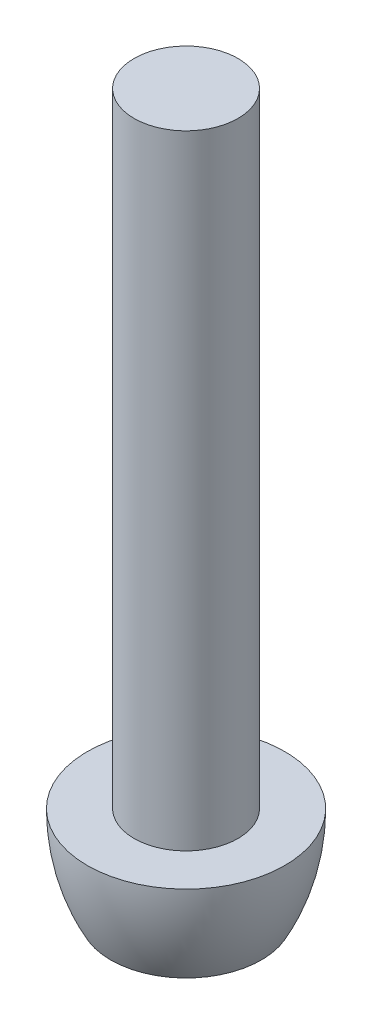
ISO-10303-21;
HEADER;
FILE_DESCRIPTION(('STEP AP214'),'2;1');
FILE_NAME('part.step','',(''),(''),'','','');
FILE_SCHEMA(('AUTOMOTIVE_DESIGN { 1 0 10303 214 1 1 1 1 }'));
ENDSEC;
DATA;
#1=APPLICATION_CONTEXT('core data for automotive mechanical design processes');
#2=APPLICATION_PROTOCOL_DEFINITION('international standard','automotive_design',2000,#1);
#3=PRODUCT_CONTEXT('',#1,'mechanical');
#4=PRODUCT('Part','Part','',(#3));
#5=PRODUCT_RELATED_PRODUCT_CATEGORY('part','',(#4));
#6=PRODUCT_DEFINITION_FORMATION('','',#4);
#7=PRODUCT_DEFINITION_CONTEXT('part definition',#1,'design');
#8=PRODUCT_DEFINITION('design','',#6,#7);
#9=PRODUCT_DEFINITION_SHAPE('','',#8);
#10=(LENGTH_UNIT() NAMED_UNIT(*) SI_UNIT(.MILLI.,.METRE.));
#11=(NAMED_UNIT(*) PLANE_ANGLE_UNIT() SI_UNIT($,.RADIAN.));
#12=(NAMED_UNIT(*) SI_UNIT($,.STERADIAN.) SOLID_ANGLE_UNIT());
#13=UNCERTAINTY_MEASURE_WITH_UNIT(LENGTH_MEASURE(1.E-05),#10,'distance_accuracy_value','');
#14=(GEOMETRIC_REPRESENTATION_CONTEXT(3) GLOBAL_UNCERTAINTY_ASSIGNED_CONTEXT((#13)) GLOBAL_UNIT_ASSIGNED_CONTEXT((#10,
#11,#12)) REPRESENTATION_CONTEXT('',''));
#15=CARTESIAN_POINT('',(0.,0.,0.));
#16=DIRECTION('',(0.,0.,1.));
#17=DIRECTION('',(1.,0.,0.));
#18=AXIS2_PLACEMENT_3D('',#15,#16,#17);
#19=CARTESIAN_POINT('',(0.,12.,0.));
#20=DIRECTION('',(0.,-1.,0.));
#21=DIRECTION('',(0.,0.,-1.));
#22=AXIS2_PLACEMENT_3D('',#19,#20,#21);
#23=CYLINDRICAL_SURFACE('',#22,1.);
#24=CARTESIAN_POINT('',(0.,12.,0.));
#25=DIRECTION('',(0.,1.,0.));
#26=DIRECTION('',(0.,0.,1.));
#27=AXIS2_PLACEMENT_3D('',#24,#25,#26);
#28=CIRCLE('',#27,1.);
#29=CARTESIAN_POINT('',(0.,12.,1.));
#30=VERTEX_POINT('',#29);
#31=EDGE_CURVE('E11',#30,#30,#28,.T.);
#32=ORIENTED_EDGE('',*,*,#31,.F.);
#33=EDGE_LOOP('',(#32));
#34=FACE_BOUND('',#33,.T.);
#35=CARTESIAN_POINT('',(0.,0.,0.));
#36=DIRECTION('',(0.,1.,0.));
#37=DIRECTION('',(0.,0.,1.));
#38=AXIS2_PLACEMENT_3D('',#35,#36,#37);
#39=CIRCLE('',#38,1.);
#40=CARTESIAN_POINT('',(0.,0.,1.));
#41=VERTEX_POINT('',#40);
#42=EDGE_CURVE('E40',#41,#41,#39,.T.);
#43=ORIENTED_EDGE('',*,*,#42,.T.);
#44=EDGE_LOOP('',(#43));
#45=FACE_BOUND('',#44,.T.);
#46=ADVANCED_FACE('F37',(#34,#45),#23,.T.);
#47=CARTESIAN_POINT('',(0.,12.,0.));
#48=DIRECTION('',(0.,1.,0.));
#49=DIRECTION('',(0.,0.,1.));
#50=AXIS2_PLACEMENT_3D('',#47,#48,#49);
#51=PLANE('',#50);
#52=ORIENTED_EDGE('',*,*,#31,.T.);
#53=EDGE_LOOP('',(#52));
#54=FACE_BOUND('',#53,.T.);
#55=ADVANCED_FACE('F158',(#54),#51,.T.);
#56=CARTESIAN_POINT('',(0.,0.,0.));
#57=DIRECTION('',(0.,1.,0.));
#58=DIRECTION('',(0.,0.,1.));
#59=AXIS2_PLACEMENT_3D('',#56,#57,#58);
#60=PLANE('',#59);
#61=ORIENTED_EDGE('',*,*,#42,.F.);
#62=EDGE_LOOP('',(#61));
#63=FACE_BOUND('',#62,.T.);
#64=CARTESIAN_POINT('',(0.,0.,0.));
#65=DIRECTION('',(0.,1.,0.));
#66=DIRECTION('',(0.,0.,1.));
#67=AXIS2_PLACEMENT_3D('',#64,#65,#66);
#68=CIRCLE('',#67,1.9);
#69=CARTESIAN_POINT('',(0.,0.,1.9));
#70=VERTEX_POINT('',#69);
#71=EDGE_CURVE('E138',#70,#70,#68,.T.);
#72=ORIENTED_EDGE('',*,*,#71,.T.);
#73=EDGE_LOOP('',(#72));
#74=FACE_BOUND('',#73,.T.);
#75=ADVANCED_FACE('F154',(#63,#74),#60,.T.);
#76=CARTESIAN_POINT('',(0.,0.,0.));
#77=DIRECTION('',(0.,1.,0.));
#78=DIRECTION('',(0.,0.,1.));
#79=AXIS2_PLACEMENT_3D('',#76,#77,#78);
#80=DEGENERATE_TOROIDAL_SURFACE('',#79,1.925,3.825,.F.);
#81=ORIENTED_EDGE('',*,*,#71,.F.);
#82=EDGE_LOOP('',(#81));
#83=FACE_BOUND('',#82,.T.);
#84=CARTESIAN_POINT('',(0.,-1.8,0.));
#85=DIRECTION('',(0.,1.,0.));
#86=DIRECTION('',(0.,0.,1.));
#87=AXIS2_PLACEMENT_3D('',#84,#85,#86);
#88=CIRCLE('',#87,1.45);
#89=CARTESIAN_POINT('',(0.,-1.8,1.45));
#90=VERTEX_POINT('',#89);
#91=EDGE_CURVE('E146',#90,#90,#88,.T.);
#92=ORIENTED_EDGE('',*,*,#91,.T.);
#93=EDGE_LOOP('',(#92));
#94=FACE_BOUND('',#93,.T.);
#95=ADVANCED_FACE('F157',(#83,#94),#80,.F.);
#96=CARTESIAN_POINT('',(0.,-1.8,0.));
#97=DIRECTION('',(0.,1.,0.));
#98=DIRECTION('',(0.,0.,1.));
#99=AXIS2_PLACEMENT_3D('',#96,#97,#98);
#100=PLANE('',#99);
#101=DIRECTION('',(1.,0.,0.));
#102=VECTOR('',#101,1.);
#103=CARTESIAN_POINT('',(-0.288675134594813,-1.8,-0.5));
#104=LINE('',#103,#102);
#105=CARTESIAN_POINT('',(-0.288675134594813,-1.8,-0.5));
#106=VERTEX_POINT('',#105);
#107=CARTESIAN_POINT('',(0.288675134594813,-1.8,-0.5));
#108=VERTEX_POINT('',#107);
#109=EDGE_CURVE('E125',#106,#108,#104,.T.);
#110=ORIENTED_EDGE('',*,*,#109,.F.);
#111=DIRECTION('',(0.5,0.,-0.866025403784439));
#112=VECTOR('',#111,1.);
#113=CARTESIAN_POINT('',(-0.577350269189626,-1.8,0.));
#114=LINE('',#113,#112);
#115=CARTESIAN_POINT('',(-0.577350269189626,-1.8,0.));
#116=VERTEX_POINT('',#115);
#117=EDGE_CURVE('E51',#116,#106,#114,.T.);
#118=ORIENTED_EDGE('',*,*,#117,.F.);
#119=DIRECTION('',(-0.5,0.,-0.866025403784438));
#120=VECTOR('',#119,1.);
#121=CARTESIAN_POINT('',(-0.288675134594813,-1.8,0.5));
#122=LINE('',#121,#120);
#123=CARTESIAN_POINT('',(-0.288675134594813,-1.8,0.5));
#124=VERTEX_POINT('',#123);
#125=EDGE_CURVE('E134',#124,#116,#122,.T.);
#126=ORIENTED_EDGE('',*,*,#125,.F.);
#127=DIRECTION('',(-1.,0.,0.));
#128=VECTOR('',#127,1.);
#129=CARTESIAN_POINT('',(0.288675134594812,-1.8,0.5));
#130=LINE('',#129,#128);
#131=CARTESIAN_POINT('',(0.288675134594812,-1.8,0.5));
#132=VERTEX_POINT('',#131);
#133=EDGE_CURVE('E132',#132,#124,#130,.T.);
#134=ORIENTED_EDGE('',*,*,#133,.F.);
#135=DIRECTION('',(-0.5,0.,0.866025403784438));
#136=VECTOR('',#135,1.);
#137=CARTESIAN_POINT('',(0.577350269189626,-1.8,0.));
#138=LINE('',#137,#136);
#139=CARTESIAN_POINT('',(0.577350269189626,-1.8,0.));
#140=VERTEX_POINT('',#139);
#141=EDGE_CURVE('E99',#140,#132,#138,.T.);
#142=ORIENTED_EDGE('',*,*,#141,.F.);
#143=DIRECTION('',(0.5,0.,0.866025403784439));
#144=VECTOR('',#143,1.);
#145=CARTESIAN_POINT('',(0.288675134594813,-1.8,-0.5));
#146=LINE('',#145,#144);
#147=EDGE_CURVE('E128',#108,#140,#146,.T.);
#148=ORIENTED_EDGE('',*,*,#147,.F.);
#149=EDGE_LOOP('',(#110,#118,#126,#134,#142,#148));
#150=FACE_BOUND('',#149,.T.);
#151=ORIENTED_EDGE('',*,*,#91,.F.);
#152=EDGE_LOOP('',(#151));
#153=FACE_BOUND('',#152,.T.);
#154=ADVANCED_FACE('F163',(#150,#153),#100,.F.);
#155=CARTESIAN_POINT('',(-0.577350269189626,-1.2,0.));
#156=DIRECTION('',(-0.866025403784439,0.,-0.5));
#157=DIRECTION('',(-0.5,0.,0.866025403784439));
#158=AXIS2_PLACEMENT_3D('',#155,#156,#157);
#159=PLANE('',#158);
#160=ORIENTED_EDGE('',*,*,#117,.T.);
#161=DIRECTION('',(0.,-1.,0.));
#162=VECTOR('',#161,1.);
#163=CARTESIAN_POINT('',(-0.288675134594813,-1.2,-0.5));
#164=LINE('',#163,#162);
#165=CARTESIAN_POINT('',(-0.288675134594813,-1.2,-0.5));
#166=VERTEX_POINT('',#165);
#167=EDGE_CURVE('E81',#166,#106,#164,.T.);
#168=ORIENTED_EDGE('',*,*,#167,.F.);
#169=DIRECTION('',(0.5,0.,-0.866025403784439));
#170=VECTOR('',#169,1.);
#171=CARTESIAN_POINT('',(-0.577350269189626,-1.2,0.));
#172=LINE('',#171,#170);
#173=CARTESIAN_POINT('',(-0.577350269189626,-1.2,0.));
#174=VERTEX_POINT('',#173);
#175=EDGE_CURVE('E136',#174,#166,#172,.T.);
#176=ORIENTED_EDGE('',*,*,#175,.F.);
#177=DIRECTION('',(0.,-1.,0.));
#178=VECTOR('',#177,1.);
#179=CARTESIAN_POINT('',(-0.577350269189626,-1.2,0.));
#180=LINE('',#179,#178);
#181=EDGE_CURVE('E59',#174,#116,#180,.T.);
#182=ORIENTED_EDGE('',*,*,#181,.T.);
#183=EDGE_LOOP('',(#160,#168,#176,#182));
#184=FACE_BOUND('',#183,.T.);
#185=ADVANCED_FACE('F168',(#184),#159,.F.);
#186=CARTESIAN_POINT('',(-0.288675134594813,-1.2,0.5));
#187=DIRECTION('',(-0.866025403784439,0.,0.5));
#188=DIRECTION('',(0.5,0.,0.866025403784439));
#189=AXIS2_PLACEMENT_3D('',#186,#187,#188);
#190=PLANE('',#189);
#191=ORIENTED_EDGE('',*,*,#125,.T.);
#192=ORIENTED_EDGE('',*,*,#181,.F.);
#193=DIRECTION('',(-0.5,0.,-0.866025403784438));
#194=VECTOR('',#193,1.);
#195=CARTESIAN_POINT('',(-0.288675134594813,-1.2,0.5));
#196=LINE('',#195,#194);
#197=CARTESIAN_POINT('',(-0.288675134594813,-1.2,0.5));
#198=VERTEX_POINT('',#197);
#199=EDGE_CURVE('E111',#198,#174,#196,.T.);
#200=ORIENTED_EDGE('',*,*,#199,.F.);
#201=DIRECTION('',(0.,-1.,0.));
#202=VECTOR('',#201,1.);
#203=CARTESIAN_POINT('',(-0.288675134594813,-1.2,0.5));
#204=LINE('',#203,#202);
#205=EDGE_CURVE('E103',#198,#124,#204,.T.);
#206=ORIENTED_EDGE('',*,*,#205,.T.);
#207=EDGE_LOOP('',(#191,#192,#200,#206));
#208=FACE_BOUND('',#207,.T.);
#209=ADVANCED_FACE('F205',(#208),#190,.F.);
#210=CARTESIAN_POINT('',(0.288675134594812,-1.2,0.5));
#211=DIRECTION('',(0.,0.,1.));
#212=DIRECTION('',(1.,0.,0.));
#213=AXIS2_PLACEMENT_3D('',#210,#211,#212);
#214=PLANE('',#213);
#215=ORIENTED_EDGE('',*,*,#133,.T.);
#216=ORIENTED_EDGE('',*,*,#205,.F.);
#217=DIRECTION('',(-1.,0.,0.));
#218=VECTOR('',#217,1.);
#219=CARTESIAN_POINT('',(0.288675134594812,-1.2,0.5));
#220=LINE('',#219,#218);
#221=CARTESIAN_POINT('',(0.288675134594812,-1.2,0.5));
#222=VERTEX_POINT('',#221);
#223=EDGE_CURVE('E107',#222,#198,#220,.T.);
#224=ORIENTED_EDGE('',*,*,#223,.F.);
#225=DIRECTION('',(0.,-1.,0.));
#226=VECTOR('',#225,1.);
#227=CARTESIAN_POINT('',(0.288675134594812,-1.2,0.5));
#228=LINE('',#227,#226);
#229=EDGE_CURVE('E92',#222,#132,#228,.T.);
#230=ORIENTED_EDGE('',*,*,#229,.T.);
#231=EDGE_LOOP('',(#215,#216,#224,#230));
#232=FACE_BOUND('',#231,.T.);
#233=ADVANCED_FACE('F108',(#232),#214,.F.);
#234=CARTESIAN_POINT('',(0.577350269189626,-1.2,0.));
#235=DIRECTION('',(0.866025403784438,0.,0.5));
#236=DIRECTION('',(0.5,0.,-0.866025403784439));
#237=AXIS2_PLACEMENT_3D('',#234,#235,#236);
#238=PLANE('',#237);
#239=ORIENTED_EDGE('',*,*,#141,.T.);
#240=ORIENTED_EDGE('',*,*,#229,.F.);
#241=DIRECTION('',(-0.5,0.,0.866025403784438));
#242=VECTOR('',#241,1.);
#243=CARTESIAN_POINT('',(0.577350269189626,-1.2,0.));
#244=LINE('',#243,#242);
#245=CARTESIAN_POINT('',(0.577350269189626,-1.2,0.));
#246=VERTEX_POINT('',#245);
#247=EDGE_CURVE('E96',#246,#222,#244,.T.);
#248=ORIENTED_EDGE('',*,*,#247,.F.);
#249=DIRECTION('',(0.,-1.,0.));
#250=VECTOR('',#249,1.);
#251=CARTESIAN_POINT('',(0.577350269189626,-1.2,0.));
#252=LINE('',#251,#250);
#253=EDGE_CURVE('E104',#246,#140,#252,.T.);
#254=ORIENTED_EDGE('',*,*,#253,.T.);
#255=EDGE_LOOP('',(#239,#240,#248,#254));
#256=FACE_BOUND('',#255,.T.);
#257=ADVANCED_FACE('F94',(#256),#238,.F.);
#258=CARTESIAN_POINT('',(0.288675134594813,-1.2,-0.5));
#259=DIRECTION('',(0.866025403784439,0.,-0.5));
#260=DIRECTION('',(-0.5,0.,-0.866025403784439));
#261=AXIS2_PLACEMENT_3D('',#258,#259,#260);
#262=PLANE('',#261);
#263=ORIENTED_EDGE('',*,*,#147,.T.);
#264=ORIENTED_EDGE('',*,*,#253,.F.);
#265=DIRECTION('',(0.5,0.,0.866025403784439));
#266=VECTOR('',#265,1.);
#267=CARTESIAN_POINT('',(0.288675134594813,-1.2,-0.5));
#268=LINE('',#267,#266);
#269=CARTESIAN_POINT('',(0.288675134594813,-1.2,-0.5));
#270=VERTEX_POINT('',#269);
#271=EDGE_CURVE('E117',#270,#246,#268,.T.);
#272=ORIENTED_EDGE('',*,*,#271,.F.);
#273=DIRECTION('',(0.,-1.,0.));
#274=VECTOR('',#273,1.);
#275=CARTESIAN_POINT('',(0.288675134594813,-1.2,-0.5));
#276=LINE('',#275,#274);
#277=EDGE_CURVE('E141',#270,#108,#276,.T.);
#278=ORIENTED_EDGE('',*,*,#277,.T.);
#279=EDGE_LOOP('',(#263,#264,#272,#278));
#280=FACE_BOUND('',#279,.T.);
#281=ADVANCED_FACE('F229',(#280),#262,.F.);
#282=CARTESIAN_POINT('',(-0.288675134594813,-1.2,-0.5));
#283=DIRECTION('',(0.,0.,-1.));
#284=DIRECTION('',(-1.,0.,0.));
#285=AXIS2_PLACEMENT_3D('',#282,#283,#284);
#286=PLANE('',#285);
#287=ORIENTED_EDGE('',*,*,#109,.T.);
#288=ORIENTED_EDGE('',*,*,#277,.F.);
#289=DIRECTION('',(1.,0.,0.));
#290=VECTOR('',#289,1.);
#291=CARTESIAN_POINT('',(-0.288675134594813,-1.2,-0.5));
#292=LINE('',#291,#290);
#293=EDGE_CURVE('E119',#166,#270,#292,.T.);
#294=ORIENTED_EDGE('',*,*,#293,.F.);
#295=ORIENTED_EDGE('',*,*,#167,.T.);
#296=EDGE_LOOP('',(#287,#288,#294,#295));
#297=FACE_BOUND('',#296,.T.);
#298=ADVANCED_FACE('F238',(#297),#286,.F.);
#299=CARTESIAN_POINT('',(0.,-1.2,0.));
#300=DIRECTION('',(0.,-1.,0.));
#301=DIRECTION('',(0.,0.,-1.));
#302=AXIS2_PLACEMENT_3D('',#299,#300,#301);
#303=PLANE('',#302);
#304=ORIENTED_EDGE('',*,*,#175,.T.);
#305=ORIENTED_EDGE('',*,*,#293,.T.);
#306=ORIENTED_EDGE('',*,*,#271,.T.);
#307=ORIENTED_EDGE('',*,*,#247,.T.);
#308=ORIENTED_EDGE('',*,*,#223,.T.);
#309=ORIENTED_EDGE('',*,*,#199,.T.);
#310=EDGE_LOOP('',(#304,#305,#306,#307,#308,#309));
#311=FACE_BOUND('',#310,.T.);
#312=ADVANCED_FACE('F114',(#311),#303,.T.);
#313=CLOSED_SHELL('',(#46,#55,#75,#95,#154,#185,#209,#233,#257,#281,#298,#312));
#314=MANIFOLD_SOLID_BREP('B2',#313);
#315=ADVANCED_BREP_SHAPE_REPRESENTATION('',(#18,#314),#14);
#316=SHAPE_DEFINITION_REPRESENTATION(#9,#315);
ENDSEC;
END-ISO-10303-21;
